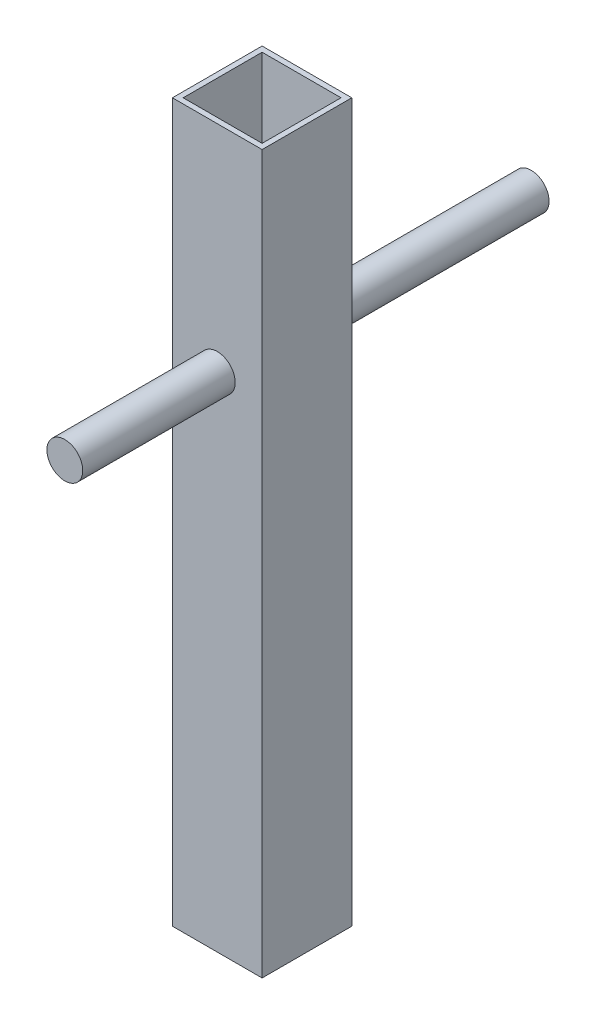
ISO-10303-21;
HEADER;
FILE_DESCRIPTION(('STEP AP214'),'2;1');
FILE_NAME('part.step','',(''),(''),'','','');
FILE_SCHEMA(('AUTOMOTIVE_DESIGN { 1 0 10303 214 1 1 1 1 }'));
ENDSEC;
DATA;
#1=APPLICATION_CONTEXT('core data for automotive mechanical design processes');
#2=APPLICATION_PROTOCOL_DEFINITION('international standard','automotive_design',2000,#1);
#3=PRODUCT_CONTEXT('',#1,'mechanical');
#4=PRODUCT('Part','Part','',(#3));
#5=PRODUCT_RELATED_PRODUCT_CATEGORY('part','',(#4));
#6=PRODUCT_DEFINITION_FORMATION('','',#4);
#7=PRODUCT_DEFINITION_CONTEXT('part definition',#1,'design');
#8=PRODUCT_DEFINITION('design','',#6,#7);
#9=PRODUCT_DEFINITION_SHAPE('','',#8);
#10=(LENGTH_UNIT() NAMED_UNIT(*) SI_UNIT(.MILLI.,.METRE.));
#11=(NAMED_UNIT(*) PLANE_ANGLE_UNIT() SI_UNIT($,.RADIAN.));
#12=(NAMED_UNIT(*) SI_UNIT($,.STERADIAN.) SOLID_ANGLE_UNIT());
#13=UNCERTAINTY_MEASURE_WITH_UNIT(LENGTH_MEASURE(1.E-05),#10,'distance_accuracy_value','');
#14=(GEOMETRIC_REPRESENTATION_CONTEXT(3) GLOBAL_UNCERTAINTY_ASSIGNED_CONTEXT((#13)) GLOBAL_UNIT_ASSIGNED_CONTEXT((#10,
#11,#12)) REPRESENTATION_CONTEXT('',''));
#15=CARTESIAN_POINT('',(0.,0.,0.));
#16=DIRECTION('',(0.,0.,1.));
#17=DIRECTION('',(1.,0.,0.));
#18=AXIS2_PLACEMENT_3D('',#15,#16,#17);
#19=CARTESIAN_POINT('',(0.,200.,0.));
#20=DIRECTION('',(0.,1.,0.));
#21=DIRECTION('',(0.,0.,1.));
#22=AXIS2_PLACEMENT_3D('',#19,#20,#21);
#23=PLANE('',#22);
#24=DIRECTION('',(0.,0.,-1.));
#25=VECTOR('',#24,1.);
#26=CARTESIAN_POINT('',(12.5,200.,-12.5));
#27=LINE('',#26,#25);
#28=CARTESIAN_POINT('',(12.5,200.,12.5));
#29=VERTEX_POINT('',#28);
#30=CARTESIAN_POINT('',(12.5,200.,-12.5));
#31=VERTEX_POINT('',#30);
#32=EDGE_CURVE('E137',#29,#31,#27,.T.);
#33=ORIENTED_EDGE('',*,*,#32,.T.);
#34=DIRECTION('',(-1.,0.,0.));
#35=VECTOR('',#34,1.);
#36=CARTESIAN_POINT('',(-12.5,200.,-12.5));
#37=LINE('',#36,#35);
#38=CARTESIAN_POINT('',(-12.5,200.,-12.5));
#39=VERTEX_POINT('',#38);
#40=EDGE_CURVE('E140',#31,#39,#37,.T.);
#41=ORIENTED_EDGE('',*,*,#40,.T.);
#42=DIRECTION('',(0.,0.,1.));
#43=VECTOR('',#42,1.);
#44=CARTESIAN_POINT('',(-12.5,200.,-12.5));
#45=LINE('',#44,#43);
#46=CARTESIAN_POINT('',(-12.5,200.,12.5));
#47=VERTEX_POINT('',#46);
#48=EDGE_CURVE('E143',#39,#47,#45,.T.);
#49=ORIENTED_EDGE('',*,*,#48,.T.);
#50=DIRECTION('',(1.,0.,0.));
#51=VECTOR('',#50,1.);
#52=CARTESIAN_POINT('',(-12.5,200.,12.5));
#53=LINE('',#52,#51);
#54=EDGE_CURVE('E145',#47,#29,#53,.T.);
#55=ORIENTED_EDGE('',*,*,#54,.T.);
#56=EDGE_LOOP('',(#33,#41,#49,#55));
#57=FACE_BOUND('',#56,.T.);
#58=DIRECTION('',(-1.,0.,0.));
#59=VECTOR('',#58,1.);
#60=CARTESIAN_POINT('',(-11.,200.,-11.));
#61=LINE('',#60,#59);
#62=CARTESIAN_POINT('',(11.,200.,-11.));
#63=VERTEX_POINT('',#62);
#64=CARTESIAN_POINT('',(-11.,200.,-11.));
#65=VERTEX_POINT('',#64);
#66=EDGE_CURVE('E107',#63,#65,#61,.T.);
#67=ORIENTED_EDGE('',*,*,#66,.F.);
#68=DIRECTION('',(0.,0.,-1.));
#69=VECTOR('',#68,1.);
#70=CARTESIAN_POINT('',(11.,200.,-11.));
#71=LINE('',#70,#69);
#72=CARTESIAN_POINT('',(11.,200.,11.));
#73=VERTEX_POINT('',#72);
#74=EDGE_CURVE('E99',#73,#63,#71,.T.);
#75=ORIENTED_EDGE('',*,*,#74,.F.);
#76=DIRECTION('',(1.,0.,0.));
#77=VECTOR('',#76,1.);
#78=CARTESIAN_POINT('',(-11.,200.,11.));
#79=LINE('',#78,#77);
#80=CARTESIAN_POINT('',(-11.,200.,11.));
#81=VERTEX_POINT('',#80);
#82=EDGE_CURVE('E121',#81,#73,#79,.T.);
#83=ORIENTED_EDGE('',*,*,#82,.F.);
#84=DIRECTION('',(0.,0.,1.));
#85=VECTOR('',#84,1.);
#86=CARTESIAN_POINT('',(-11.,200.,-11.));
#87=LINE('',#86,#85);
#88=EDGE_CURVE('E119',#65,#81,#87,.T.);
#89=ORIENTED_EDGE('',*,*,#88,.F.);
#90=EDGE_LOOP('',(#67,#75,#83,#89));
#91=FACE_BOUND('',#90,.T.);
#92=ADVANCED_FACE('F33',(#57,#91),#23,.T.);
#93=CARTESIAN_POINT('',(0.,0.,0.));
#94=DIRECTION('',(0.,1.,0.));
#95=DIRECTION('',(0.,0.,1.));
#96=AXIS2_PLACEMENT_3D('',#93,#94,#95);
#97=PLANE('',#96);
#98=DIRECTION('',(0.,0.,-1.));
#99=VECTOR('',#98,1.);
#100=CARTESIAN_POINT('',(12.5,0.,-12.5));
#101=LINE('',#100,#99);
#102=CARTESIAN_POINT('',(12.5,0.,12.5));
#103=VERTEX_POINT('',#102);
#104=CARTESIAN_POINT('',(12.5,0.,-12.5));
#105=VERTEX_POINT('',#104);
#106=EDGE_CURVE('E115',#103,#105,#101,.T.);
#107=ORIENTED_EDGE('',*,*,#106,.F.);
#108=DIRECTION('',(1.,0.,0.));
#109=VECTOR('',#108,1.);
#110=CARTESIAN_POINT('',(-12.5,0.,12.5));
#111=LINE('',#110,#109);
#112=CARTESIAN_POINT('',(-12.5,0.,12.5));
#113=VERTEX_POINT('',#112);
#114=EDGE_CURVE('E141',#113,#103,#111,.T.);
#115=ORIENTED_EDGE('',*,*,#114,.F.);
#116=DIRECTION('',(0.,0.,1.));
#117=VECTOR('',#116,1.);
#118=CARTESIAN_POINT('',(-12.5,0.,-12.5));
#119=LINE('',#118,#117);
#120=CARTESIAN_POINT('',(-12.5,0.,-12.5));
#121=VERTEX_POINT('',#120);
#122=EDGE_CURVE('E152',#121,#113,#119,.T.);
#123=ORIENTED_EDGE('',*,*,#122,.F.);
#124=DIRECTION('',(-1.,0.,0.));
#125=VECTOR('',#124,1.);
#126=CARTESIAN_POINT('',(-12.5,0.,-12.5));
#127=LINE('',#126,#125);
#128=EDGE_CURVE('E150',#105,#121,#127,.T.);
#129=ORIENTED_EDGE('',*,*,#128,.F.);
#130=EDGE_LOOP('',(#107,#115,#123,#129));
#131=FACE_BOUND('',#130,.T.);
#132=DIRECTION('',(0.,0.,-1.));
#133=VECTOR('',#132,1.);
#134=CARTESIAN_POINT('',(11.,0.,-11.));
#135=LINE('',#134,#133);
#136=CARTESIAN_POINT('',(11.,0.,11.));
#137=VERTEX_POINT('',#136);
#138=CARTESIAN_POINT('',(11.,0.,-11.));
#139=VERTEX_POINT('',#138);
#140=EDGE_CURVE('E57',#137,#139,#135,.T.);
#141=ORIENTED_EDGE('',*,*,#140,.T.);
#142=DIRECTION('',(-1.,0.,0.));
#143=VECTOR('',#142,1.);
#144=CARTESIAN_POINT('',(-11.,0.,-11.));
#145=LINE('',#144,#143);
#146=CARTESIAN_POINT('',(-11.,0.,-11.));
#147=VERTEX_POINT('',#146);
#148=EDGE_CURVE('E114',#139,#147,#145,.T.);
#149=ORIENTED_EDGE('',*,*,#148,.T.);
#150=DIRECTION('',(0.,0.,1.));
#151=VECTOR('',#150,1.);
#152=CARTESIAN_POINT('',(-11.,0.,-11.));
#153=LINE('',#152,#151);
#154=CARTESIAN_POINT('',(-11.,0.,11.));
#155=VERTEX_POINT('',#154);
#156=EDGE_CURVE('E129',#147,#155,#153,.T.);
#157=ORIENTED_EDGE('',*,*,#156,.T.);
#158=DIRECTION('',(1.,0.,0.));
#159=VECTOR('',#158,1.);
#160=CARTESIAN_POINT('',(-11.,0.,11.));
#161=LINE('',#160,#159);
#162=EDGE_CURVE('E108',#155,#137,#161,.T.);
#163=ORIENTED_EDGE('',*,*,#162,.T.);
#164=EDGE_LOOP('',(#141,#149,#157,#163));
#165=FACE_BOUND('',#164,.T.);
#166=ADVANCED_FACE('F171',(#131,#165),#97,.F.);
#167=CARTESIAN_POINT('',(12.5,200.,-12.5));
#168=DIRECTION('',(-1.,0.,0.));
#169=DIRECTION('',(0.,0.,1.));
#170=AXIS2_PLACEMENT_3D('',#167,#168,#169);
#171=PLANE('',#170);
#172=ORIENTED_EDGE('',*,*,#106,.T.);
#173=DIRECTION('',(0.,-1.,0.));
#174=VECTOR('',#173,1.);
#175=CARTESIAN_POINT('',(12.5,200.,-12.5));
#176=LINE('',#175,#174);
#177=EDGE_CURVE('E11',#31,#105,#176,.T.);
#178=ORIENTED_EDGE('',*,*,#177,.F.);
#179=ORIENTED_EDGE('',*,*,#32,.F.);
#180=DIRECTION('',(0.,-1.,0.));
#181=VECTOR('',#180,1.);
#182=CARTESIAN_POINT('',(12.5,200.,12.5));
#183=LINE('',#182,#181);
#184=EDGE_CURVE('E147',#29,#103,#183,.T.);
#185=ORIENTED_EDGE('',*,*,#184,.T.);
#186=EDGE_LOOP('',(#172,#178,#179,#185));
#187=FACE_BOUND('',#186,.T.);
#188=ADVANCED_FACE('F35',(#187),#171,.F.);
#189=CARTESIAN_POINT('',(-12.5,200.,-12.5));
#190=DIRECTION('',(0.,0.,1.));
#191=DIRECTION('',(1.,0.,0.));
#192=AXIS2_PLACEMENT_3D('',#189,#190,#191);
#193=PLANE('',#192);
#194=CARTESIAN_POINT('',(0.,140.,-12.5));
#195=DIRECTION('',(0.,0.,1.));
#196=DIRECTION('',(1.,0.,0.));
#197=AXIS2_PLACEMENT_3D('',#194,#195,#196);
#198=CIRCLE('',#197,5.00000000000001);
#199=CARTESIAN_POINT('',(5.00000000000001,140.,-12.5));
#200=VERTEX_POINT('',#199);
#201=EDGE_CURVE('E208',#200,#200,#198,.T.);
#202=ORIENTED_EDGE('',*,*,#201,.T.);
#203=EDGE_LOOP('',(#202));
#204=FACE_BOUND('',#203,.T.);
#205=ORIENTED_EDGE('',*,*,#128,.T.);
#206=DIRECTION('',(0.,-1.,0.));
#207=VECTOR('',#206,1.);
#208=CARTESIAN_POINT('',(-12.5,200.,-12.5));
#209=LINE('',#208,#207);
#210=EDGE_CURVE('E42',#39,#121,#209,.T.);
#211=ORIENTED_EDGE('',*,*,#210,.F.);
#212=ORIENTED_EDGE('',*,*,#40,.F.);
#213=ORIENTED_EDGE('',*,*,#177,.T.);
#214=EDGE_LOOP('',(#205,#211,#212,#213));
#215=FACE_BOUND('',#214,.T.);
#216=ADVANCED_FACE('F181',(#204,#215),#193,.F.);
#217=CARTESIAN_POINT('',(-12.5,200.,-12.5));
#218=DIRECTION('',(1.,0.,0.));
#219=DIRECTION('',(0.,0.,-1.));
#220=AXIS2_PLACEMENT_3D('',#217,#218,#219);
#221=PLANE('',#220);
#222=ORIENTED_EDGE('',*,*,#122,.T.);
#223=DIRECTION('',(0.,-1.,0.));
#224=VECTOR('',#223,1.);
#225=CARTESIAN_POINT('',(-12.5,200.,12.5));
#226=LINE('',#225,#224);
#227=EDGE_CURVE('E157',#47,#113,#226,.T.);
#228=ORIENTED_EDGE('',*,*,#227,.F.);
#229=ORIENTED_EDGE('',*,*,#48,.F.);
#230=ORIENTED_EDGE('',*,*,#210,.T.);
#231=EDGE_LOOP('',(#222,#228,#229,#230));
#232=FACE_BOUND('',#231,.T.);
#233=ADVANCED_FACE('F165',(#232),#221,.F.);
#234=CARTESIAN_POINT('',(-12.5,200.,12.5));
#235=DIRECTION('',(0.,0.,-1.));
#236=DIRECTION('',(-1.,0.,0.));
#237=AXIS2_PLACEMENT_3D('',#234,#235,#236);
#238=PLANE('',#237);
#239=CARTESIAN_POINT('',(0.,140.,12.5));
#240=DIRECTION('',(0.,0.,1.));
#241=DIRECTION('',(1.,0.,0.));
#242=AXIS2_PLACEMENT_3D('',#239,#240,#241);
#243=CIRCLE('',#242,5.);
#244=CARTESIAN_POINT('',(5.,140.,12.5));
#245=VERTEX_POINT('',#244);
#246=EDGE_CURVE('E206',#245,#245,#243,.T.);
#247=ORIENTED_EDGE('',*,*,#246,.F.);
#248=EDGE_LOOP('',(#247));
#249=FACE_BOUND('',#248,.T.);
#250=ORIENTED_EDGE('',*,*,#114,.T.);
#251=ORIENTED_EDGE('',*,*,#184,.F.);
#252=ORIENTED_EDGE('',*,*,#54,.F.);
#253=ORIENTED_EDGE('',*,*,#227,.T.);
#254=EDGE_LOOP('',(#250,#251,#252,#253));
#255=FACE_BOUND('',#254,.T.);
#256=ADVANCED_FACE('F175',(#249,#255),#238,.F.);
#257=CARTESIAN_POINT('',(11.,200.,-11.));
#258=DIRECTION('',(-1.,0.,0.));
#259=DIRECTION('',(0.,0.,1.));
#260=AXIS2_PLACEMENT_3D('',#257,#258,#259);
#261=PLANE('',#260);
#262=ORIENTED_EDGE('',*,*,#140,.F.);
#263=DIRECTION('',(0.,-1.,0.));
#264=VECTOR('',#263,1.);
#265=CARTESIAN_POINT('',(11.,200.,11.));
#266=LINE('',#265,#264);
#267=EDGE_CURVE('E103',#73,#137,#266,.T.);
#268=ORIENTED_EDGE('',*,*,#267,.F.);
#269=ORIENTED_EDGE('',*,*,#74,.T.);
#270=DIRECTION('',(0.,-1.,0.));
#271=VECTOR('',#270,1.);
#272=CARTESIAN_POINT('',(11.,200.,-11.));
#273=LINE('',#272,#271);
#274=EDGE_CURVE('E102',#63,#139,#273,.T.);
#275=ORIENTED_EDGE('',*,*,#274,.T.);
#276=EDGE_LOOP('',(#262,#268,#269,#275));
#277=FACE_BOUND('',#276,.T.);
#278=ADVANCED_FACE('F101',(#277),#261,.T.);
#279=CARTESIAN_POINT('',(-11.,200.,-11.));
#280=DIRECTION('',(0.,0.,1.));
#281=DIRECTION('',(1.,0.,0.));
#282=AXIS2_PLACEMENT_3D('',#279,#280,#281);
#283=PLANE('',#282);
#284=CARTESIAN_POINT('',(0.,140.,-11.));
#285=DIRECTION('',(0.,0.,1.));
#286=DIRECTION('',(1.,0.,0.));
#287=AXIS2_PLACEMENT_3D('',#284,#285,#286);
#288=CIRCLE('',#287,5.);
#289=CARTESIAN_POINT('',(5.,140.,-11.));
#290=VERTEX_POINT('',#289);
#291=EDGE_CURVE('E127',#290,#290,#288,.T.);
#292=ORIENTED_EDGE('',*,*,#291,.F.);
#293=EDGE_LOOP('',(#292));
#294=FACE_BOUND('',#293,.T.);
#295=ORIENTED_EDGE('',*,*,#148,.F.);
#296=ORIENTED_EDGE('',*,*,#274,.F.);
#297=ORIENTED_EDGE('',*,*,#66,.T.);
#298=DIRECTION('',(0.,-1.,0.));
#299=VECTOR('',#298,1.);
#300=CARTESIAN_POINT('',(-11.,200.,-11.));
#301=LINE('',#300,#299);
#302=EDGE_CURVE('E116',#65,#147,#301,.T.);
#303=ORIENTED_EDGE('',*,*,#302,.T.);
#304=EDGE_LOOP('',(#295,#296,#297,#303));
#305=FACE_BOUND('',#304,.T.);
#306=ADVANCED_FACE('F111',(#294,#305),#283,.T.);
#307=CARTESIAN_POINT('',(-11.,200.,-11.));
#308=DIRECTION('',(1.,0.,0.));
#309=DIRECTION('',(0.,0.,-1.));
#310=AXIS2_PLACEMENT_3D('',#307,#308,#309);
#311=PLANE('',#310);
#312=ORIENTED_EDGE('',*,*,#156,.F.);
#313=ORIENTED_EDGE('',*,*,#302,.F.);
#314=ORIENTED_EDGE('',*,*,#88,.T.);
#315=DIRECTION('',(0.,-1.,0.));
#316=VECTOR('',#315,1.);
#317=CARTESIAN_POINT('',(-11.,200.,11.));
#318=LINE('',#317,#316);
#319=EDGE_CURVE('E49',#81,#155,#318,.T.);
#320=ORIENTED_EDGE('',*,*,#319,.T.);
#321=EDGE_LOOP('',(#312,#313,#314,#320));
#322=FACE_BOUND('',#321,.T.);
#323=ADVANCED_FACE('F221',(#322),#311,.T.);
#324=CARTESIAN_POINT('',(-11.,200.,11.));
#325=DIRECTION('',(0.,0.,-1.));
#326=DIRECTION('',(-1.,0.,0.));
#327=AXIS2_PLACEMENT_3D('',#324,#325,#326);
#328=PLANE('',#327);
#329=CARTESIAN_POINT('',(0.,140.,11.));
#330=DIRECTION('',(0.,0.,-1.));
#331=DIRECTION('',(-1.,0.,0.));
#332=AXIS2_PLACEMENT_3D('',#329,#330,#331);
#333=CIRCLE('',#332,5.);
#334=CARTESIAN_POINT('',(-5.,140.,11.));
#335=VERTEX_POINT('',#334);
#336=EDGE_CURVE('E37',#335,#335,#333,.T.);
#337=ORIENTED_EDGE('',*,*,#336,.F.);
#338=EDGE_LOOP('',(#337));
#339=FACE_BOUND('',#338,.T.);
#340=ORIENTED_EDGE('',*,*,#162,.F.);
#341=ORIENTED_EDGE('',*,*,#319,.F.);
#342=ORIENTED_EDGE('',*,*,#82,.T.);
#343=ORIENTED_EDGE('',*,*,#267,.T.);
#344=EDGE_LOOP('',(#340,#341,#342,#343));
#345=FACE_BOUND('',#344,.T.);
#346=ADVANCED_FACE('F225',(#339,#345),#328,.T.);
#347=CARTESIAN_POINT('',(0.,140.,-75.));
#348=DIRECTION('',(0.,0.,1.));
#349=DIRECTION('',(1.,0.,0.));
#350=AXIS2_PLACEMENT_3D('',#347,#348,#349);
#351=CYLINDRICAL_SURFACE('',#350,5.00000000000001);
#352=ORIENTED_EDGE('',*,*,#291,.T.);
#353=EDGE_LOOP('',(#352));
#354=FACE_BOUND('',#353,.T.);
#355=ORIENTED_EDGE('',*,*,#336,.T.);
#356=EDGE_LOOP('',(#355));
#357=FACE_BOUND('',#356,.T.);
#358=ADVANCED_FACE('F217',(#354,#357),#351,.T.);
#359=CARTESIAN_POINT('',(0.,140.,55.));
#360=DIRECTION('',(0.,0.,1.));
#361=DIRECTION('',(1.,0.,0.));
#362=AXIS2_PLACEMENT_3D('',#359,#360,#361);
#363=PLANE('',#362);
#364=CARTESIAN_POINT('',(0.,140.,55.));
#365=DIRECTION('',(0.,0.,1.));
#366=DIRECTION('',(1.,0.,0.));
#367=AXIS2_PLACEMENT_3D('',#364,#365,#366);
#368=CIRCLE('',#367,5.00000000000001);
#369=CARTESIAN_POINT('',(5.00000000000001,140.,55.));
#370=VERTEX_POINT('',#369);
#371=EDGE_CURVE('E249',#370,#370,#368,.T.);
#372=ORIENTED_EDGE('',*,*,#371,.T.);
#373=EDGE_LOOP('',(#372));
#374=FACE_BOUND('',#373,.T.);
#375=ADVANCED_FACE('F234',(#374),#363,.T.);
#376=ORIENTED_EDGE('',*,*,#371,.F.);
#377=EDGE_LOOP('',(#376));
#378=FACE_BOUND('',#377,.T.);
#379=ORIENTED_EDGE('',*,*,#246,.T.);
#380=EDGE_LOOP('',(#379));
#381=FACE_BOUND('',#380,.T.);
#382=ADVANCED_FACE('F236',(#378,#381),#351,.T.);
#383=CARTESIAN_POINT('',(0.,140.,-75.));
#384=DIRECTION('',(0.,0.,1.));
#385=DIRECTION('',(1.,0.,0.));
#386=AXIS2_PLACEMENT_3D('',#383,#384,#385);
#387=CIRCLE('',#386,5.00000000000001);
#388=CARTESIAN_POINT('',(5.00000000000001,140.,-75.));
#389=VERTEX_POINT('',#388);
#390=EDGE_CURVE('E211',#389,#389,#387,.T.);
#391=ORIENTED_EDGE('',*,*,#390,.T.);
#392=EDGE_LOOP('',(#391));
#393=FACE_BOUND('',#392,.T.);
#394=ORIENTED_EDGE('',*,*,#201,.F.);
#395=EDGE_LOOP('',(#394));
#396=FACE_BOUND('',#395,.T.);
#397=ADVANCED_FACE('F235',(#393,#396),#351,.T.);
#398=CARTESIAN_POINT('',(0.,140.,-75.));
#399=DIRECTION('',(0.,0.,1.));
#400=DIRECTION('',(1.,0.,0.));
#401=AXIS2_PLACEMENT_3D('',#398,#399,#400);
#402=PLANE('',#401);
#403=ORIENTED_EDGE('',*,*,#390,.F.);
#404=EDGE_LOOP('',(#403));
#405=FACE_BOUND('',#404,.T.);
#406=ADVANCED_FACE('F237',(#405),#402,.F.);
#407=CLOSED_SHELL('',(#92,#166,#188,#216,#233,#256,#278,#306,#323,#346,#358,#375,#382,#397,#406));
#408=MANIFOLD_SOLID_BREP('B2',#407);
#409=ADVANCED_BREP_SHAPE_REPRESENTATION('',(#18,#408),#14);
#410=SHAPE_DEFINITION_REPRESENTATION(#9,#409);
ENDSEC;
END-ISO-10303-21;
